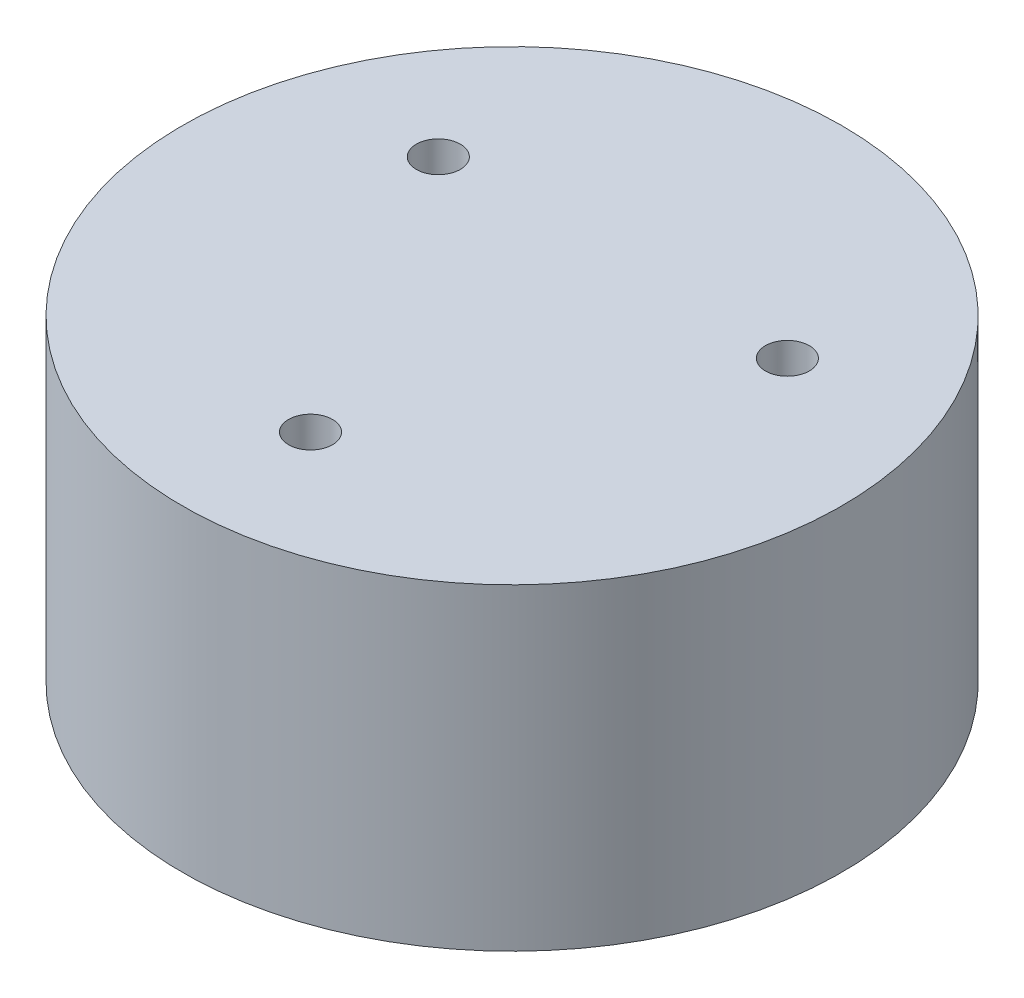
ISO-10303-21;
HEADER;
FILE_DESCRIPTION(('STEP AP214'),'2;1');
FILE_NAME('part.step','',(''),(''),'','','');
FILE_SCHEMA(('AUTOMOTIVE_DESIGN { 1 0 10303 214 1 1 1 1 }'));
ENDSEC;
DATA;
#1=APPLICATION_CONTEXT('core data for automotive mechanical design processes');
#2=APPLICATION_PROTOCOL_DEFINITION('international standard','automotive_design',2000,#1);
#3=PRODUCT_CONTEXT('',#1,'mechanical');
#4=PRODUCT('Part','Part','',(#3));
#5=PRODUCT_RELATED_PRODUCT_CATEGORY('part','',(#4));
#6=PRODUCT_DEFINITION_FORMATION('','',#4);
#7=PRODUCT_DEFINITION_CONTEXT('part definition',#1,'design');
#8=PRODUCT_DEFINITION('design','',#6,#7);
#9=PRODUCT_DEFINITION_SHAPE('','',#8);
#10=(LENGTH_UNIT() NAMED_UNIT(*) SI_UNIT(.MILLI.,.METRE.));
#11=(NAMED_UNIT(*) PLANE_ANGLE_UNIT() SI_UNIT($,.RADIAN.));
#12=(NAMED_UNIT(*) SI_UNIT($,.STERADIAN.) SOLID_ANGLE_UNIT());
#13=UNCERTAINTY_MEASURE_WITH_UNIT(LENGTH_MEASURE(1.E-05),#10,'distance_accuracy_value','');
#14=(GEOMETRIC_REPRESENTATION_CONTEXT(3) GLOBAL_UNCERTAINTY_ASSIGNED_CONTEXT((#13)) GLOBAL_UNIT_ASSIGNED_CONTEXT((#10,
#11,#12)) REPRESENTATION_CONTEXT('',''));
#15=CARTESIAN_POINT('',(0.,0.,0.));
#16=DIRECTION('',(0.,0.,1.));
#17=DIRECTION('',(1.,0.,0.));
#18=AXIS2_PLACEMENT_3D('',#15,#16,#17);
#19=CARTESIAN_POINT('',(0.,26.,0.));
#20=DIRECTION('',(0.,-1.,0.));
#21=DIRECTION('',(0.,0.,-1.));
#22=AXIS2_PLACEMENT_3D('',#19,#20,#21);
#23=CYLINDRICAL_SURFACE('',#22,27.);
#24=CARTESIAN_POINT('',(0.,26.,0.));
#25=DIRECTION('',(0.,1.,0.));
#26=DIRECTION('',(0.,0.,1.));
#27=AXIS2_PLACEMENT_3D('',#24,#25,#26);
#28=CIRCLE('',#27,27.);
#29=CARTESIAN_POINT('',(0.,26.,-27.));
#30=VERTEX_POINT('',#29);
#31=EDGE_CURVE('E10',#30,#30,#28,.T.);
#32=CARTESIAN_POINT('',(0.,0.,0.));
#33=DIRECTION('',(0.,1.,0.));
#34=DIRECTION('',(0.,0.,1.));
#35=AXIS2_PLACEMENT_3D('',#32,#33,#34);
#36=CIRCLE('',#35,27.);
#37=CARTESIAN_POINT('',(0.,0.,-27.));
#38=VERTEX_POINT('',#37);
#39=EDGE_CURVE('E44',#38,#38,#36,.T.);
#40=CARTESIAN_POINT('',(0.,26.,-27.));
#41=CARTESIAN_POINT('',(0.,25.7291666666667,-27.));
#42=CARTESIAN_POINT('',(0.,25.4583333333333,-27.));
#43=CARTESIAN_POINT('',(0.,24.9166666666667,-27.));
#44=CARTESIAN_POINT('',(0.,24.6458333333333,-27.));
#45=CARTESIAN_POINT('',(0.,24.1041666666667,-27.));
#46=CARTESIAN_POINT('',(0.,23.8333333333333,-27.));
#47=CARTESIAN_POINT('',(0.,23.2916666666667,-27.));
#48=CARTESIAN_POINT('',(0.,23.0208333333333,-27.));
#49=CARTESIAN_POINT('',(0.,22.4791666666667,-27.));
#50=CARTESIAN_POINT('',(0.,22.2083333333333,-27.));
#51=CARTESIAN_POINT('',(0.,21.6666666666667,-27.));
#52=CARTESIAN_POINT('',(0.,21.3958333333333,-27.));
#53=CARTESIAN_POINT('',(0.,20.8541666666667,-27.));
#54=CARTESIAN_POINT('',(0.,20.5833333333333,-27.));
#55=CARTESIAN_POINT('',(0.,20.0416666666667,-27.));
#56=CARTESIAN_POINT('',(0.,19.7708333333333,-27.));
#57=CARTESIAN_POINT('',(0.,19.2291666666667,-27.));
#58=CARTESIAN_POINT('',(0.,18.9583333333333,-27.));
#59=CARTESIAN_POINT('',(0.,18.4166666666667,-27.));
#60=CARTESIAN_POINT('',(0.,18.1458333333333,-27.));
#61=CARTESIAN_POINT('',(0.,17.6041666666667,-27.));
#62=CARTESIAN_POINT('',(0.,17.3333333333333,-27.));
#63=CARTESIAN_POINT('',(0.,16.7916666666667,-27.));
#64=CARTESIAN_POINT('',(0.,16.5208333333333,-27.));
#65=CARTESIAN_POINT('',(0.,15.9791666666667,-27.));
#66=CARTESIAN_POINT('',(0.,15.7083333333333,-27.));
#67=CARTESIAN_POINT('',(0.,15.1666666666667,-27.));
#68=CARTESIAN_POINT('',(0.,14.8958333333333,-27.));
#69=CARTESIAN_POINT('',(0.,14.3541666666667,-27.));
#70=CARTESIAN_POINT('',(0.,14.0833333333333,-27.));
#71=CARTESIAN_POINT('',(0.,13.5416666666667,-27.));
#72=CARTESIAN_POINT('',(0.,13.2708333333333,-27.));
#73=CARTESIAN_POINT('',(0.,12.7291666666667,-27.));
#74=CARTESIAN_POINT('',(0.,12.4583333333333,-27.));
#75=CARTESIAN_POINT('',(0.,11.9166666666667,-27.));
#76=CARTESIAN_POINT('',(0.,11.6458333333333,-27.));
#77=CARTESIAN_POINT('',(0.,11.1041666666667,-27.));
#78=CARTESIAN_POINT('',(0.,10.8333333333333,-27.));
#79=CARTESIAN_POINT('',(0.,10.2916666666667,-27.));
#80=CARTESIAN_POINT('',(0.,10.0208333333333,-27.));
#81=CARTESIAN_POINT('',(0.,9.47916666666667,-27.));
#82=CARTESIAN_POINT('',(0.,9.20833333333333,-27.));
#83=CARTESIAN_POINT('',(0.,8.66666666666667,-27.));
#84=CARTESIAN_POINT('',(0.,8.39583333333333,-27.));
#85=CARTESIAN_POINT('',(0.,7.85416666666667,-27.));
#86=CARTESIAN_POINT('',(0.,7.58333333333333,-27.));
#87=CARTESIAN_POINT('',(0.,7.04166666666667,-27.));
#88=CARTESIAN_POINT('',(0.,6.77083333333333,-27.));
#89=CARTESIAN_POINT('',(0.,6.22916666666667,-27.));
#90=CARTESIAN_POINT('',(0.,5.95833333333333,-27.));
#91=CARTESIAN_POINT('',(0.,5.41666666666667,-27.));
#92=CARTESIAN_POINT('',(0.,5.14583333333333,-27.));
#93=CARTESIAN_POINT('',(0.,4.60416666666667,-27.));
#94=CARTESIAN_POINT('',(0.,4.33333333333333,-27.));
#95=CARTESIAN_POINT('',(0.,3.79166666666667,-27.));
#96=CARTESIAN_POINT('',(0.,3.52083333333333,-27.));
#97=CARTESIAN_POINT('',(0.,2.97916666666667,-27.));
#98=CARTESIAN_POINT('',(0.,2.70833333333333,-27.));
#99=CARTESIAN_POINT('',(0.,2.16666666666667,-27.));
#100=CARTESIAN_POINT('',(0.,1.89583333333333,-27.));
#101=CARTESIAN_POINT('',(0.,1.35416666666667,-27.));
#102=CARTESIAN_POINT('',(0.,1.08333333333333,-27.));
#103=CARTESIAN_POINT('',(0.,0.541666666666667,-27.));
#104=CARTESIAN_POINT('',(0.,0.270833333333334,-27.));
#105=CARTESIAN_POINT('',(0.,0.,-27.));
#106=B_SPLINE_CURVE_WITH_KNOTS('',3,(#40,#41,#42,#43,#44,#45,#46,#47,#48,#49,#50,#51,#52,#53,
#54,#55,#56,#57,#58,#59,#60,#61,#62,#63,#64,#65,#66,#67,#68,#69,#70,#71,#72,#73,#74,#75,#76,#77,
#78,#79,#80,#81,#82,#83,#84,#85,#86,#87,#88,#89,#90,#91,#92,#93,#94,#95,#96,#97,#98,#99,#100,
#101,#102,#103,#104,#105),.UNSPECIFIED.,.F.,.F.,(4,2,2,2,2,2,2,2,2,2,2,2,2,2,2,2,2,2,2,2,2,2,2,
2,2,2,2,2,2,2,2,2,4),(0.,0.812499999999997,1.625,2.4375,3.25,4.0625,4.875,5.6875,6.5,7.3125,
8.125,8.93749999999999,9.74999999999999,10.5625,11.375,12.1875,13.,13.8125,14.625,15.4375,16.25,
17.0625,17.875,18.6875,19.5,20.3125,21.125,21.9375,22.75,23.5625,24.375,25.1875,26.),.UNSPECIFIED.);
#107=EDGE_CURVE('BSEAM39',#30,#38,#106,.T.);
#108=ORIENTED_EDGE('',*,*,#31,.F.);
#109=ORIENTED_EDGE('',*,*,#39,.T.);
#110=ORIENTED_EDGE('',*,*,#107,.T.);
#111=ORIENTED_EDGE('',*,*,#107,.F.);
#112=EDGE_LOOP('',(#108,#110,#109,#111));
#113=FACE_BOUND('',#112,.T.);
#114=ADVANCED_FACE('F39',(#113),#23,.T.);
#115=CARTESIAN_POINT('',(0.,26.,0.));
#116=DIRECTION('',(0.,1.,0.));
#117=DIRECTION('',(0.,0.,1.));
#118=AXIS2_PLACEMENT_3D('',#115,#116,#117);
#119=PLANE('',#118);
#120=CARTESIAN_POINT('',(0.,26.,16.51));
#121=DIRECTION('',(0.,-1.,0.));
#122=DIRECTION('',(0.,0.,-1.));
#123=AXIS2_PLACEMENT_3D('',#120,#121,#122);
#124=CIRCLE('',#123,1.79999999999999);
#125=CARTESIAN_POINT('',(0.,26.,14.71));
#126=VERTEX_POINT('',#125);
#127=EDGE_CURVE('E82',#126,#126,#124,.T.);
#128=ORIENTED_EDGE('',*,*,#127,.T.);
#129=EDGE_LOOP('',(#128));
#130=FACE_BOUND('',#129,.T.);
#131=CARTESIAN_POINT('',(14.2980794164811,26.,-8.25499999999996));
#132=DIRECTION('',(0.,-1.,0.));
#133=DIRECTION('',(0.,0.,-1.));
#134=AXIS2_PLACEMENT_3D('',#131,#132,#133);
#135=CIRCLE('',#134,1.79999999999999);
#136=CARTESIAN_POINT('',(14.2980794164811,26.,-10.055));
#137=VERTEX_POINT('',#136);
#138=EDGE_CURVE('E67',#137,#137,#135,.T.);
#139=ORIENTED_EDGE('',*,*,#138,.T.);
#140=EDGE_LOOP('',(#139));
#141=FACE_BOUND('',#140,.T.);
#142=CARTESIAN_POINT('',(-14.298079416481,26.,-8.25500000000007));
#143=DIRECTION('',(0.,-1.,0.));
#144=DIRECTION('',(0.,0.,-1.));
#145=AXIS2_PLACEMENT_3D('',#142,#143,#144);
#146=CIRCLE('',#145,1.79999999999999);
#147=CARTESIAN_POINT('',(-14.298079416481,26.,-10.0550000000001));
#148=VERTEX_POINT('',#147);
#149=EDGE_CURVE('E51',#148,#148,#146,.T.);
#150=ORIENTED_EDGE('',*,*,#149,.T.);
#151=EDGE_LOOP('',(#150));
#152=FACE_BOUND('',#151,.T.);
#153=ORIENTED_EDGE('',*,*,#31,.T.);
#154=EDGE_LOOP('',(#153));
#155=FACE_BOUND('',#154,.T.);
#156=ADVANCED_FACE('F132',(#130,#141,#152,#155),#119,.T.);
#157=CARTESIAN_POINT('',(0.,0.,0.));
#158=DIRECTION('',(0.,1.,0.));
#159=DIRECTION('',(0.,0.,1.));
#160=AXIS2_PLACEMENT_3D('',#157,#158,#159);
#161=PLANE('',#160);
#162=CARTESIAN_POINT('',(-14.298079416481,0.,8.25500000000007));
#163=DIRECTION('',(0.,-1.,0.));
#164=DIRECTION('',(0.,0.,-1.));
#165=AXIS2_PLACEMENT_3D('',#162,#163,#164);
#166=CIRCLE('',#165,3.65000000000001);
#167=CARTESIAN_POINT('',(-14.298079416481,0.,4.60500000000006));
#168=VERTEX_POINT('',#167);
#169=EDGE_CURVE('E121',#168,#168,#166,.T.);
#170=ORIENTED_EDGE('',*,*,#169,.F.);
#171=EDGE_LOOP('',(#170));
#172=FACE_BOUND('',#171,.T.);
#173=CARTESIAN_POINT('',(0.,0.,-16.51));
#174=DIRECTION('',(0.,-1.,0.));
#175=DIRECTION('',(0.,0.,-1.));
#176=AXIS2_PLACEMENT_3D('',#173,#174,#175);
#177=CIRCLE('',#176,3.65000000000001);
#178=CARTESIAN_POINT('',(0.,0.,-20.16));
#179=VERTEX_POINT('',#178);
#180=EDGE_CURVE('E112',#179,#179,#177,.T.);
#181=ORIENTED_EDGE('',*,*,#180,.F.);
#182=EDGE_LOOP('',(#181));
#183=FACE_BOUND('',#182,.T.);
#184=CARTESIAN_POINT('',(14.2980794164811,0.,8.25499999999997));
#185=DIRECTION('',(0.,-1.,0.));
#186=DIRECTION('',(0.,0.,-1.));
#187=AXIS2_PLACEMENT_3D('',#184,#185,#186);
#188=CIRCLE('',#187,3.65000000000001);
#189=CARTESIAN_POINT('',(14.2980794164811,0.,4.60499999999995));
#190=VERTEX_POINT('',#189);
#191=EDGE_CURVE('E103',#190,#190,#188,.T.);
#192=ORIENTED_EDGE('',*,*,#191,.F.);
#193=EDGE_LOOP('',(#192));
#194=FACE_BOUND('',#193,.T.);
#195=CARTESIAN_POINT('',(0.,0.,16.51));
#196=DIRECTION('',(0.,-1.,0.));
#197=DIRECTION('',(0.,0.,-1.));
#198=AXIS2_PLACEMENT_3D('',#195,#196,#197);
#199=CIRCLE('',#198,3.275);
#200=CARTESIAN_POINT('',(0.,0.,13.235));
#201=VERTEX_POINT('',#200);
#202=EDGE_CURVE('E94',#201,#201,#199,.T.);
#203=ORIENTED_EDGE('',*,*,#202,.F.);
#204=EDGE_LOOP('',(#203));
#205=FACE_BOUND('',#204,.T.);
#206=CARTESIAN_POINT('',(14.2980794164811,0.,-8.25499999999996));
#207=DIRECTION('',(0.,-1.,0.));
#208=DIRECTION('',(0.,0.,-1.));
#209=AXIS2_PLACEMENT_3D('',#206,#207,#208);
#210=CIRCLE('',#209,3.275);
#211=CARTESIAN_POINT('',(14.2980794164811,0.,-11.53));
#212=VERTEX_POINT('',#211);
#213=EDGE_CURVE('E79',#212,#212,#210,.T.);
#214=ORIENTED_EDGE('',*,*,#213,.F.);
#215=EDGE_LOOP('',(#214));
#216=FACE_BOUND('',#215,.T.);
#217=CARTESIAN_POINT('',(-14.298079416481,0.,-8.25500000000007));
#218=DIRECTION('',(0.,-1.,0.));
#219=DIRECTION('',(0.,0.,-1.));
#220=AXIS2_PLACEMENT_3D('',#217,#218,#219);
#221=CIRCLE('',#220,3.275);
#222=CARTESIAN_POINT('',(-14.298079416481,0.,-11.5300000000001));
#223=VERTEX_POINT('',#222);
#224=EDGE_CURVE('E64',#223,#223,#221,.T.);
#225=ORIENTED_EDGE('',*,*,#224,.F.);
#226=EDGE_LOOP('',(#225));
#227=FACE_BOUND('',#226,.T.);
#228=ORIENTED_EDGE('',*,*,#39,.F.);
#229=EDGE_LOOP('',(#228));
#230=FACE_BOUND('',#229,.T.);
#231=ADVANCED_FACE('F128',(#172,#183,#194,#205,#216,#227,#230),#161,.F.);
#232=CARTESIAN_POINT('',(-14.298079416481,0.,-8.25500000000007));
#233=DIRECTION('',(0.,-1.,0.));
#234=DIRECTION('',(0.,0.,-1.));
#235=AXIS2_PLACEMENT_3D('',#232,#233,#234);
#236=CYLINDRICAL_SURFACE('',#235,1.79999999999999);
#237=ORIENTED_EDGE('',*,*,#149,.F.);
#238=EDGE_LOOP('',(#237));
#239=FACE_BOUND('',#238,.T.);
#240=CARTESIAN_POINT('',(-14.298079416481,18.,-8.25500000000007));
#241=DIRECTION('',(0.,-1.,0.));
#242=DIRECTION('',(0.,0.,-1.));
#243=AXIS2_PLACEMENT_3D('',#240,#241,#242);
#244=CIRCLE('',#243,1.8);
#245=CARTESIAN_POINT('',(-14.298079416481,18.,-10.0550000000001));
#246=VERTEX_POINT('',#245);
#247=EDGE_CURVE('E55',#246,#246,#244,.T.);
#248=ORIENTED_EDGE('',*,*,#247,.T.);
#249=EDGE_LOOP('',(#248));
#250=FACE_BOUND('',#249,.T.);
#251=ADVANCED_FACE('F131',(#239,#250),#236,.F.);
#252=CARTESIAN_POINT('',(-11.048079416481,18.,-8.25500000000007));
#253=DIRECTION('',(0.,1.,0.));
#254=DIRECTION('',(0.,0.,1.));
#255=AXIS2_PLACEMENT_3D('',#252,#253,#254);
#256=PLANE('',#255);
#257=ORIENTED_EDGE('',*,*,#247,.F.);
#258=EDGE_LOOP('',(#257));
#259=FACE_BOUND('',#258,.T.);
#260=CARTESIAN_POINT('',(-14.298079416481,18.,-8.25500000000007));
#261=DIRECTION('',(0.,-1.,0.));
#262=DIRECTION('',(0.,0.,-1.));
#263=AXIS2_PLACEMENT_3D('',#260,#261,#262);
#264=CIRCLE('',#263,3.25);
#265=CARTESIAN_POINT('',(-14.298079416481,18.,-11.5050000000001));
#266=VERTEX_POINT('',#265);
#267=EDGE_CURVE('E58',#266,#266,#264,.T.);
#268=ORIENTED_EDGE('',*,*,#267,.T.);
#269=EDGE_LOOP('',(#268));
#270=FACE_BOUND('',#269,.T.);
#271=ADVANCED_FACE('F237',(#259,#270),#256,.F.);
#272=CARTESIAN_POINT('',(-14.298079416481,0.,-8.25500000000007));
#273=DIRECTION('',(0.,-1.,0.));
#274=DIRECTION('',(0.,0.,-1.));
#275=AXIS2_PLACEMENT_3D('',#272,#273,#274);
#276=CYLINDRICAL_SURFACE('',#275,3.25);
#277=ORIENTED_EDGE('',*,*,#267,.F.);
#278=EDGE_LOOP('',(#277));
#279=FACE_BOUND('',#278,.T.);
#280=CARTESIAN_POINT('',(-14.298079416481,0.0250000000000006,-8.25500000000007));
#281=DIRECTION('',(0.,-1.,0.));
#282=DIRECTION('',(0.,0.,-1.));
#283=AXIS2_PLACEMENT_3D('',#280,#281,#282);
#284=CIRCLE('',#283,3.25);
#285=CARTESIAN_POINT('',(-14.298079416481,0.0250000000000006,-11.5050000000001));
#286=VERTEX_POINT('',#285);
#287=EDGE_CURVE('E61',#286,#286,#284,.T.);
#288=ORIENTED_EDGE('',*,*,#287,.T.);
#289=EDGE_LOOP('',(#288));
#290=FACE_BOUND('',#289,.T.);
#291=ADVANCED_FACE('F233',(#279,#290),#276,.F.);
#292=CARTESIAN_POINT('',(-14.298079416481,0.,-8.25500000000007));
#293=DIRECTION('',(0.,-1.,0.));
#294=DIRECTION('',(0.,0.,-1.));
#295=AXIS2_PLACEMENT_3D('',#292,#293,#294);
#296=CONICAL_SURFACE('',#295,3.275,0.785398163397451);
#297=ORIENTED_EDGE('',*,*,#287,.F.);
#298=EDGE_LOOP('',(#297));
#299=FACE_BOUND('',#298,.T.);
#300=ORIENTED_EDGE('',*,*,#224,.T.);
#301=EDGE_LOOP('',(#300));
#302=FACE_BOUND('',#301,.T.);
#303=ADVANCED_FACE('F229',(#299,#302),#296,.F.);
#304=CARTESIAN_POINT('',(14.2980794164811,0.,-8.25499999999996));
#305=DIRECTION('',(0.,-1.,0.));
#306=DIRECTION('',(0.,0.,-1.));
#307=AXIS2_PLACEMENT_3D('',#304,#305,#306);
#308=CYLINDRICAL_SURFACE('',#307,1.79999999999999);
#309=ORIENTED_EDGE('',*,*,#138,.F.);
#310=EDGE_LOOP('',(#309));
#311=FACE_BOUND('',#310,.T.);
#312=CARTESIAN_POINT('',(14.2980794164811,18.,-8.25499999999996));
#313=DIRECTION('',(0.,-1.,0.));
#314=DIRECTION('',(0.,0.,-1.));
#315=AXIS2_PLACEMENT_3D('',#312,#313,#314);
#316=CIRCLE('',#315,1.8);
#317=CARTESIAN_POINT('',(14.2980794164811,18.,-10.055));
#318=VERTEX_POINT('',#317);
#319=EDGE_CURVE('E70',#318,#318,#316,.T.);
#320=ORIENTED_EDGE('',*,*,#319,.T.);
#321=EDGE_LOOP('',(#320));
#322=FACE_BOUND('',#321,.T.);
#323=ADVANCED_FACE('F225',(#311,#322),#308,.F.);
#324=CARTESIAN_POINT('',(17.5480794164811,18.,-8.25499999999996));
#325=DIRECTION('',(0.,1.,0.));
#326=DIRECTION('',(0.,0.,1.));
#327=AXIS2_PLACEMENT_3D('',#324,#325,#326);
#328=PLANE('',#327);
#329=ORIENTED_EDGE('',*,*,#319,.F.);
#330=EDGE_LOOP('',(#329));
#331=FACE_BOUND('',#330,.T.);
#332=CARTESIAN_POINT('',(14.2980794164811,18.,-8.25499999999996));
#333=DIRECTION('',(0.,-1.,0.));
#334=DIRECTION('',(0.,0.,-1.));
#335=AXIS2_PLACEMENT_3D('',#332,#333,#334);
#336=CIRCLE('',#335,3.25);
#337=CARTESIAN_POINT('',(14.2980794164811,18.,-11.505));
#338=VERTEX_POINT('',#337);
#339=EDGE_CURVE('E73',#338,#338,#336,.T.);
#340=ORIENTED_EDGE('',*,*,#339,.T.);
#341=EDGE_LOOP('',(#340));
#342=FACE_BOUND('',#341,.T.);
#343=ADVANCED_FACE('F221',(#331,#342),#328,.F.);
#344=CARTESIAN_POINT('',(14.2980794164811,0.,-8.25499999999996));
#345=DIRECTION('',(0.,-1.,0.));
#346=DIRECTION('',(0.,0.,-1.));
#347=AXIS2_PLACEMENT_3D('',#344,#345,#346);
#348=CYLINDRICAL_SURFACE('',#347,3.25);
#349=ORIENTED_EDGE('',*,*,#339,.F.);
#350=EDGE_LOOP('',(#349));
#351=FACE_BOUND('',#350,.T.);
#352=CARTESIAN_POINT('',(14.2980794164811,0.0250000000000006,-8.25499999999996));
#353=DIRECTION('',(0.,-1.,0.));
#354=DIRECTION('',(0.,0.,-1.));
#355=AXIS2_PLACEMENT_3D('',#352,#353,#354);
#356=CIRCLE('',#355,3.25);
#357=CARTESIAN_POINT('',(14.2980794164811,0.0250000000000006,-11.505));
#358=VERTEX_POINT('',#357);
#359=EDGE_CURVE('E76',#358,#358,#356,.T.);
#360=ORIENTED_EDGE('',*,*,#359,.T.);
#361=EDGE_LOOP('',(#360));
#362=FACE_BOUND('',#361,.T.);
#363=ADVANCED_FACE('F217',(#351,#362),#348,.F.);
#364=CARTESIAN_POINT('',(14.2980794164811,0.,-8.25499999999996));
#365=DIRECTION('',(0.,-1.,0.));
#366=DIRECTION('',(0.,0.,-1.));
#367=AXIS2_PLACEMENT_3D('',#364,#365,#366);
#368=CONICAL_SURFACE('',#367,3.275,0.785398163397451);
#369=ORIENTED_EDGE('',*,*,#359,.F.);
#370=EDGE_LOOP('',(#369));
#371=FACE_BOUND('',#370,.T.);
#372=ORIENTED_EDGE('',*,*,#213,.T.);
#373=EDGE_LOOP('',(#372));
#374=FACE_BOUND('',#373,.T.);
#375=ADVANCED_FACE('F213',(#371,#374),#368,.F.);
#376=CARTESIAN_POINT('',(0.,0.,16.51));
#377=DIRECTION('',(0.,-1.,0.));
#378=DIRECTION('',(0.,0.,-1.));
#379=AXIS2_PLACEMENT_3D('',#376,#377,#378);
#380=CYLINDRICAL_SURFACE('',#379,1.79999999999999);
#381=ORIENTED_EDGE('',*,*,#127,.F.);
#382=EDGE_LOOP('',(#381));
#383=FACE_BOUND('',#382,.T.);
#384=CARTESIAN_POINT('',(0.,18.,16.51));
#385=DIRECTION('',(0.,-1.,0.));
#386=DIRECTION('',(0.,0.,-1.));
#387=AXIS2_PLACEMENT_3D('',#384,#385,#386);
#388=CIRCLE('',#387,1.8);
#389=CARTESIAN_POINT('',(0.,18.,14.71));
#390=VERTEX_POINT('',#389);
#391=EDGE_CURVE('E85',#390,#390,#388,.T.);
#392=ORIENTED_EDGE('',*,*,#391,.T.);
#393=EDGE_LOOP('',(#392));
#394=FACE_BOUND('',#393,.T.);
#395=ADVANCED_FACE('F209',(#383,#394),#380,.F.);
#396=CARTESIAN_POINT('',(3.25,18.,16.51));
#397=DIRECTION('',(0.,1.,0.));
#398=DIRECTION('',(0.,0.,1.));
#399=AXIS2_PLACEMENT_3D('',#396,#397,#398);
#400=PLANE('',#399);
#401=ORIENTED_EDGE('',*,*,#391,.F.);
#402=EDGE_LOOP('',(#401));
#403=FACE_BOUND('',#402,.T.);
#404=CARTESIAN_POINT('',(0.,18.,16.51));
#405=DIRECTION('',(0.,-1.,0.));
#406=DIRECTION('',(0.,0.,-1.));
#407=AXIS2_PLACEMENT_3D('',#404,#405,#406);
#408=CIRCLE('',#407,3.25);
#409=CARTESIAN_POINT('',(0.,18.,13.26));
#410=VERTEX_POINT('',#409);
#411=EDGE_CURVE('E88',#410,#410,#408,.T.);
#412=ORIENTED_EDGE('',*,*,#411,.T.);
#413=EDGE_LOOP('',(#412));
#414=FACE_BOUND('',#413,.T.);
#415=ADVANCED_FACE('F205',(#403,#414),#400,.F.);
#416=CARTESIAN_POINT('',(0.,0.,16.51));
#417=DIRECTION('',(0.,-1.,0.));
#418=DIRECTION('',(0.,0.,-1.));
#419=AXIS2_PLACEMENT_3D('',#416,#417,#418);
#420=CYLINDRICAL_SURFACE('',#419,3.25);
#421=ORIENTED_EDGE('',*,*,#411,.F.);
#422=EDGE_LOOP('',(#421));
#423=FACE_BOUND('',#422,.T.);
#424=CARTESIAN_POINT('',(0.,0.0250000000000006,16.51));
#425=DIRECTION('',(0.,-1.,0.));
#426=DIRECTION('',(0.,0.,-1.));
#427=AXIS2_PLACEMENT_3D('',#424,#425,#426);
#428=CIRCLE('',#427,3.25);
#429=CARTESIAN_POINT('',(0.,0.0250000000000006,13.26));
#430=VERTEX_POINT('',#429);
#431=EDGE_CURVE('E91',#430,#430,#428,.T.);
#432=ORIENTED_EDGE('',*,*,#431,.T.);
#433=EDGE_LOOP('',(#432));
#434=FACE_BOUND('',#433,.T.);
#435=ADVANCED_FACE('F201',(#423,#434),#420,.F.);
#436=CARTESIAN_POINT('',(0.,0.,16.51));
#437=DIRECTION('',(0.,-1.,0.));
#438=DIRECTION('',(0.,0.,-1.));
#439=AXIS2_PLACEMENT_3D('',#436,#437,#438);
#440=CONICAL_SURFACE('',#439,3.275,0.785398163397451);
#441=ORIENTED_EDGE('',*,*,#431,.F.);
#442=EDGE_LOOP('',(#441));
#443=FACE_BOUND('',#442,.T.);
#444=ORIENTED_EDGE('',*,*,#202,.T.);
#445=EDGE_LOOP('',(#444));
#446=FACE_BOUND('',#445,.T.);
#447=ADVANCED_FACE('F197',(#443,#446),#440,.F.);
#448=CARTESIAN_POINT('',(14.2980794164811,15.,8.25499999999997));
#449=DIRECTION('',(0.,1.,0.));
#450=DIRECTION('',(0.,0.,1.));
#451=AXIS2_PLACEMENT_3D('',#448,#449,#450);
#452=PLANE('',#451);
#453=CARTESIAN_POINT('',(14.2980794164811,15.,8.25499999999997));
#454=DIRECTION('',(0.,-1.,0.));
#455=DIRECTION('',(0.,0.,-1.));
#456=AXIS2_PLACEMENT_3D('',#453,#454,#455);
#457=CIRCLE('',#456,3.20000000000001);
#458=CARTESIAN_POINT('',(14.2980794164811,15.,5.05499999999995));
#459=VERTEX_POINT('',#458);
#460=EDGE_CURVE('E97',#459,#459,#457,.T.);
#461=ORIENTED_EDGE('',*,*,#460,.T.);
#462=EDGE_LOOP('',(#461));
#463=FACE_BOUND('',#462,.T.);
#464=ADVANCED_FACE('F193',(#463),#452,.F.);
#465=CARTESIAN_POINT('',(14.2980794164811,0.,8.25499999999997));
#466=DIRECTION('',(0.,-1.,0.));
#467=DIRECTION('',(0.,0.,-1.));
#468=AXIS2_PLACEMENT_3D('',#465,#466,#467);
#469=CYLINDRICAL_SURFACE('',#468,3.20000000000001);
#470=ORIENTED_EDGE('',*,*,#460,.F.);
#471=EDGE_LOOP('',(#470));
#472=FACE_BOUND('',#471,.T.);
#473=CARTESIAN_POINT('',(14.2980794164811,2.,8.25499999999997));
#474=DIRECTION('',(0.,-1.,0.));
#475=DIRECTION('',(0.,0.,-1.));
#476=AXIS2_PLACEMENT_3D('',#473,#474,#475);
#477=CIRCLE('',#476,3.20000000000001);
#478=CARTESIAN_POINT('',(14.2980794164811,2.,5.05499999999995));
#479=VERTEX_POINT('',#478);
#480=EDGE_CURVE('E100',#479,#479,#477,.T.);
#481=ORIENTED_EDGE('',*,*,#480,.T.);
#482=EDGE_LOOP('',(#481));
#483=FACE_BOUND('',#482,.T.);
#484=ADVANCED_FACE('F185',(#472,#483),#469,.F.);
#485=CARTESIAN_POINT('',(0.,15.,-16.51));
#486=DIRECTION('',(0.,1.,0.));
#487=DIRECTION('',(0.,0.,1.));
#488=AXIS2_PLACEMENT_3D('',#485,#486,#487);
#489=PLANE('',#488);
#490=CARTESIAN_POINT('',(0.,15.,-16.51));
#491=DIRECTION('',(0.,-1.,0.));
#492=DIRECTION('',(0.,0.,-1.));
#493=AXIS2_PLACEMENT_3D('',#490,#491,#492);
#494=CIRCLE('',#493,3.20000000000001);
#495=CARTESIAN_POINT('',(0.,15.,-19.71));
#496=VERTEX_POINT('',#495);
#497=EDGE_CURVE('E106',#496,#496,#494,.T.);
#498=ORIENTED_EDGE('',*,*,#497,.T.);
#499=EDGE_LOOP('',(#498));
#500=FACE_BOUND('',#499,.T.);
#501=ADVANCED_FACE('F176',(#500),#489,.F.);
#502=CARTESIAN_POINT('',(0.,0.,-16.51));
#503=DIRECTION('',(0.,-1.,0.));
#504=DIRECTION('',(0.,0.,-1.));
#505=AXIS2_PLACEMENT_3D('',#502,#503,#504);
#506=CYLINDRICAL_SURFACE('',#505,3.20000000000001);
#507=ORIENTED_EDGE('',*,*,#497,.F.);
#508=EDGE_LOOP('',(#507));
#509=FACE_BOUND('',#508,.T.);
#510=CARTESIAN_POINT('',(0.,2.,-16.51));
#511=DIRECTION('',(0.,-1.,0.));
#512=DIRECTION('',(0.,0.,-1.));
#513=AXIS2_PLACEMENT_3D('',#510,#511,#512);
#514=CIRCLE('',#513,3.20000000000001);
#515=CARTESIAN_POINT('',(0.,2.,-19.71));
#516=VERTEX_POINT('',#515);
#517=EDGE_CURVE('E109',#516,#516,#514,.T.);
#518=ORIENTED_EDGE('',*,*,#517,.T.);
#519=EDGE_LOOP('',(#518));
#520=FACE_BOUND('',#519,.T.);
#521=ADVANCED_FACE('F173',(#509,#520),#506,.F.);
#522=CARTESIAN_POINT('',(-14.298079416481,15.,8.25500000000007));
#523=DIRECTION('',(0.,1.,0.));
#524=DIRECTION('',(0.,0.,1.));
#525=AXIS2_PLACEMENT_3D('',#522,#523,#524);
#526=PLANE('',#525);
#527=CARTESIAN_POINT('',(-14.298079416481,15.,8.25500000000007));
#528=DIRECTION('',(0.,-1.,0.));
#529=DIRECTION('',(0.,0.,-1.));
#530=AXIS2_PLACEMENT_3D('',#527,#528,#529);
#531=CIRCLE('',#530,3.20000000000001);
#532=CARTESIAN_POINT('',(-14.298079416481,15.,5.05500000000006));
#533=VERTEX_POINT('',#532);
#534=EDGE_CURVE('E115',#533,#533,#531,.T.);
#535=ORIENTED_EDGE('',*,*,#534,.T.);
#536=EDGE_LOOP('',(#535));
#537=FACE_BOUND('',#536,.T.);
#538=ADVANCED_FACE('F175',(#537),#526,.F.);
#539=CARTESIAN_POINT('',(-14.298079416481,0.,8.25500000000007));
#540=DIRECTION('',(0.,-1.,0.));
#541=DIRECTION('',(0.,0.,-1.));
#542=AXIS2_PLACEMENT_3D('',#539,#540,#541);
#543=CYLINDRICAL_SURFACE('',#542,3.20000000000001);
#544=ORIENTED_EDGE('',*,*,#534,.F.);
#545=EDGE_LOOP('',(#544));
#546=FACE_BOUND('',#545,.T.);
#547=CARTESIAN_POINT('',(-14.298079416481,2.,8.25500000000007));
#548=DIRECTION('',(0.,-1.,0.));
#549=DIRECTION('',(0.,0.,-1.));
#550=AXIS2_PLACEMENT_3D('',#547,#548,#549);
#551=CIRCLE('',#550,3.20000000000001);
#552=CARTESIAN_POINT('',(-14.298079416481,2.,5.05500000000005));
#553=VERTEX_POINT('',#552);
#554=EDGE_CURVE('E118',#553,#553,#551,.T.);
#555=ORIENTED_EDGE('',*,*,#554,.T.);
#556=EDGE_LOOP('',(#555));
#557=FACE_BOUND('',#556,.T.);
#558=ADVANCED_FACE('F161',(#546,#557),#543,.F.);
#559=CARTESIAN_POINT('',(-14.298079416481,2.,8.25500000000007));
#560=DIRECTION('',(0.,-1.,0.));
#561=DIRECTION('',(0.,0.,-1.));
#562=AXIS2_PLACEMENT_3D('',#559,#560,#561);
#563=CONICAL_SURFACE('',#562,3.2,0.221314442347795);
#564=ORIENTED_EDGE('',*,*,#169,.T.);
#565=EDGE_LOOP('',(#564));
#566=FACE_BOUND('',#565,.T.);
#567=ORIENTED_EDGE('',*,*,#554,.F.);
#568=EDGE_LOOP('',(#567));
#569=FACE_BOUND('',#568,.T.);
#570=ADVANCED_FACE('F125',(#566,#569),#563,.F.);
#571=CARTESIAN_POINT('',(0.,2.,-16.51));
#572=DIRECTION('',(0.,-1.,0.));
#573=DIRECTION('',(0.,0.,-1.));
#574=AXIS2_PLACEMENT_3D('',#571,#572,#573);
#575=CONICAL_SURFACE('',#574,3.19999999999999,0.221314442347796);
#576=ORIENTED_EDGE('',*,*,#180,.T.);
#577=EDGE_LOOP('',(#576));
#578=FACE_BOUND('',#577,.T.);
#579=ORIENTED_EDGE('',*,*,#517,.F.);
#580=EDGE_LOOP('',(#579));
#581=FACE_BOUND('',#580,.T.);
#582=ADVANCED_FACE('F160',(#578,#581),#575,.F.);
#583=CARTESIAN_POINT('',(14.2980794164811,2.,8.25499999999997));
#584=DIRECTION('',(0.,-1.,0.));
#585=DIRECTION('',(0.,0.,-1.));
#586=AXIS2_PLACEMENT_3D('',#583,#584,#585);
#587=CONICAL_SURFACE('',#586,3.2,0.221314442347795);
#588=ORIENTED_EDGE('',*,*,#191,.T.);
#589=EDGE_LOOP('',(#588));
#590=FACE_BOUND('',#589,.T.);
#591=ORIENTED_EDGE('',*,*,#480,.F.);
#592=EDGE_LOOP('',(#591));
#593=FACE_BOUND('',#592,.T.);
#594=ADVANCED_FACE('F42',(#590,#593),#587,.F.);
#595=CLOSED_SHELL('',(#114,#156,#231,#251,#271,#291,#303,#323,#343,#363,#375,#395,#415,#435,
#447,#464,#484,#501,#521,#538,#558,#570,#582,#594));
#596=MANIFOLD_SOLID_BREP('B2',#595);
#597=ADVANCED_BREP_SHAPE_REPRESENTATION('',(#18,#596),#14);
#598=SHAPE_DEFINITION_REPRESENTATION(#9,#597);
ENDSEC;
END-ISO-10303-21;
